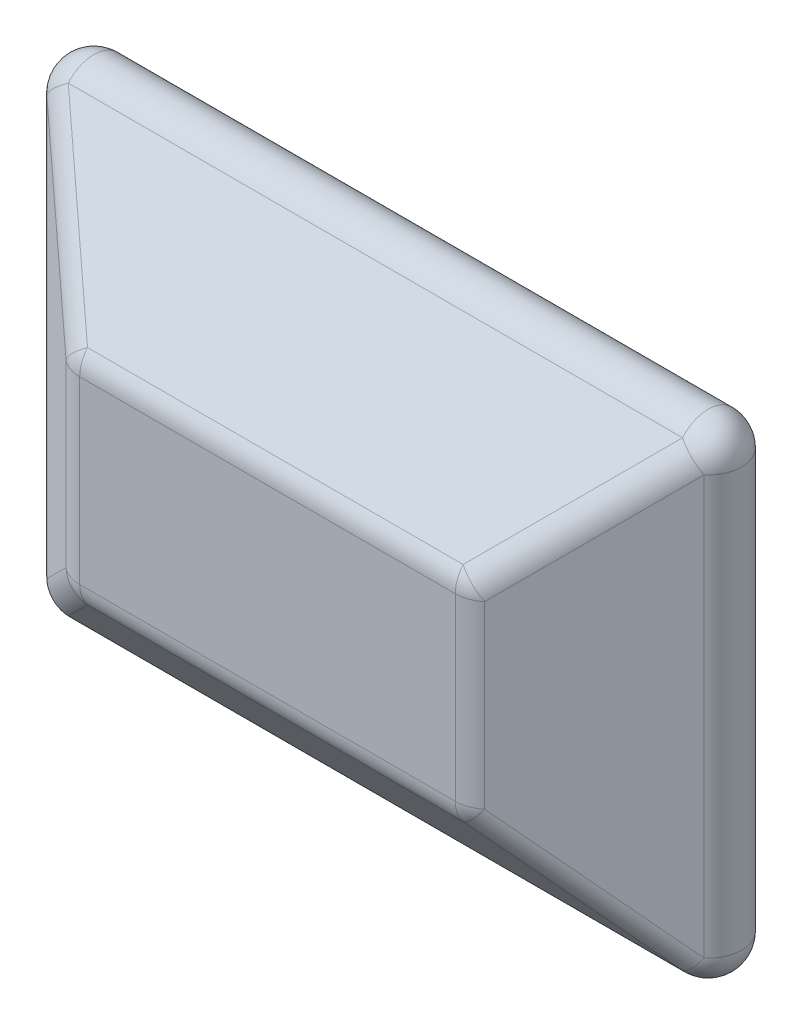
ISO-10303-21;
HEADER;
FILE_DESCRIPTION(('STEP AP214'),'2;1');
FILE_NAME('part.step','',(''),(''),'','','');
FILE_SCHEMA(('AUTOMOTIVE_DESIGN { 1 0 10303 214 1 1 1 1 }'));
ENDSEC;
DATA;
#1=APPLICATION_CONTEXT('core data for automotive mechanical design processes');
#2=APPLICATION_PROTOCOL_DEFINITION('international standard','automotive_design',2000,#1);
#3=PRODUCT_CONTEXT('',#1,'mechanical');
#4=PRODUCT('Part','Part','',(#3));
#5=PRODUCT_RELATED_PRODUCT_CATEGORY('part','',(#4));
#6=PRODUCT_DEFINITION_FORMATION('','',#4);
#7=PRODUCT_DEFINITION_CONTEXT('part definition',#1,'design');
#8=PRODUCT_DEFINITION('design','',#6,#7);
#9=PRODUCT_DEFINITION_SHAPE('','',#8);
#10=(LENGTH_UNIT() NAMED_UNIT(*) SI_UNIT(.MILLI.,.METRE.));
#11=(NAMED_UNIT(*) PLANE_ANGLE_UNIT() SI_UNIT($,.RADIAN.));
#12=(NAMED_UNIT(*) SI_UNIT($,.STERADIAN.) SOLID_ANGLE_UNIT());
#13=UNCERTAINTY_MEASURE_WITH_UNIT(LENGTH_MEASURE(1.E-05),#10,'distance_accuracy_value','');
#14=(GEOMETRIC_REPRESENTATION_CONTEXT(3) GLOBAL_UNCERTAINTY_ASSIGNED_CONTEXT((#13)) GLOBAL_UNIT_ASSIGNED_CONTEXT((#10,
#11,#12)) REPRESENTATION_CONTEXT('',''));
#15=CARTESIAN_POINT('',(0.,0.,0.));
#16=DIRECTION('',(0.,0.,1.));
#17=DIRECTION('',(1.,0.,0.));
#18=AXIS2_PLACEMENT_3D('',#15,#16,#17);
#19=CARTESIAN_POINT('',(-59.9097792499724,-30.5730567785342,50.));
#20=DIRECTION('',(-0.642787609686538,0.,0.766044443118979));
#21=DIRECTION('',(0.766044443118979,0.,0.642787609686538));
#22=AXIS2_PLACEMENT_3D('',#19,#20,#21);
#23=PLANE('',#22);
#24=DIRECTION('',(0.,-1.,0.));
#25=VECTOR('',#24,1.);
#26=CARTESIAN_POINT('',(-62.6979530041757,30.5730567785342,47.6604444311898));
#27=LINE('',#26,#25);
#28=CARTESIAN_POINT('',(-62.6979530041757,-26.9333544358722,47.6604444311898));
#29=VERTEX_POINT('',#28);
#30=CARTESIAN_POINT('',(-62.6979530041757,26.9333544358722,47.6604444311898));
#31=VERTEX_POINT('',#30);
#32=EDGE_CURVE('E217',#29,#31,#27,.F.);
#33=ORIENTED_EDGE('',*,*,#32,.T.);
#34=DIRECTION('',(0.608120402411344,-0.608120402411343,0.510273605374736));
#35=VECTOR('',#34,1.);
#36=CARTESIAN_POINT('',(-39.6744046636424,3.90980609533887,66.9794953521235));
#37=LINE('',#36,#35);
#38=CARTESIAN_POINT('',(-98.4505607820022,62.6859622136986,17.6604444311898));
#39=VERTEX_POINT('',#38);
#40=EDGE_CURVE('E219',#31,#39,#37,.F.);
#41=ORIENTED_EDGE('',*,*,#40,.T.);
#42=DIRECTION('',(0.,-1.,0.));
#43=VECTOR('',#42,1.);
#44=CARTESIAN_POINT('',(-98.4505607820022,-30.5730567785342,17.6604444311898));
#45=LINE('',#44,#43);
#46=CARTESIAN_POINT('',(-98.4505607820022,-62.6859622136986,17.6604444311898));
#47=VERTEX_POINT('',#46);
#48=EDGE_CURVE('E215',#39,#47,#45,.T.);
#49=ORIENTED_EDGE('',*,*,#48,.T.);
#50=DIRECTION('',(0.608120402411344,0.608120402411343,0.510273605374736));
#51=VECTOR('',#50,1.);
#52=CARTESIAN_POINT('',(-62.286874833674,-26.5222762653704,48.0053799724428));
#53=LINE('',#52,#51);
#54=EDGE_CURVE('E213',#47,#29,#53,.T.);
#55=ORIENTED_EDGE('',*,*,#54,.T.);
#56=EDGE_LOOP('',(#33,#41,#49,#55));
#57=FACE_BOUND('',#56,.T.);
#58=ADVANCED_FACE('F33',(#57),#23,.T.);
#59=CARTESIAN_POINT('',(59.9097792499724,-30.5730567785342,50.));
#60=DIRECTION('',(0.,-0.642787609686538,0.766044443118979));
#61=DIRECTION('',(0.,-0.766044443118979,-0.642787609686538));
#62=AXIS2_PLACEMENT_3D('',#59,#60,#61);
#63=PLANE('',#62);
#64=DIRECTION('',(1.,0.,0.));
#65=VECTOR('',#64,1.);
#66=CARTESIAN_POINT('',(-59.9097792499724,-33.3612305327375,47.6604444311898));
#67=LINE('',#66,#65);
#68=CARTESIAN_POINT('',(56.2700769073103,-33.3612305327375,47.6604444311898));
#69=VERTEX_POINT('',#68);
#70=CARTESIAN_POINT('',(-56.2700769073103,-33.3612305327375,47.6604444311898));
#71=VERTEX_POINT('',#70);
#72=EDGE_CURVE('E226',#69,#71,#67,.F.);
#73=ORIENTED_EDGE('',*,*,#72,.T.);
#74=DIRECTION('',(0.608120402411343,0.608120402411344,0.510273605374736));
#75=VECTOR('',#74,1.);
#76=CARTESIAN_POINT('',(-11.5484770249483,11.3603693496245,85.1863223981375));
#77=LINE('',#76,#75);
#78=CARTESIAN_POINT('',(-92.0226846851368,-69.1138383105639,17.6604444311898));
#79=VERTEX_POINT('',#78);
#80=EDGE_CURVE('E228',#71,#79,#77,.F.);
#81=ORIENTED_EDGE('',*,*,#80,.T.);
#82=DIRECTION('',(1.,0.,0.));
#83=VECTOR('',#82,1.);
#84=CARTESIAN_POINT('',(59.9097792499724,-69.1138383105639,17.6604444311898));
#85=LINE('',#84,#83);
#86=CARTESIAN_POINT('',(92.0226846851368,-69.1138383105639,17.6604444311898));
#87=VERTEX_POINT('',#86);
#88=EDGE_CURVE('E224',#79,#87,#85,.T.);
#89=ORIENTED_EDGE('',*,*,#88,.T.);
#90=DIRECTION('',(-0.608120402411343,0.608120402411344,0.510273605374736));
#91=VECTOR('',#90,1.);
#92=CARTESIAN_POINT('',(55.8589987368086,-32.9501523622358,48.0053799724428));
#93=LINE('',#92,#91);
#94=EDGE_CURVE('E222',#87,#69,#93,.T.);
#95=ORIENTED_EDGE('',*,*,#94,.T.);
#96=EDGE_LOOP('',(#73,#81,#89,#95));
#97=FACE_BOUND('',#96,.T.);
#98=ADVANCED_FACE('F342',(#97),#63,.T.);
#99=CARTESIAN_POINT('',(59.9097792499724,-30.5730567785342,50.));
#100=DIRECTION('',(0.642787609686538,0.,0.766044443118979));
#101=DIRECTION('',(0.766044443118979,0.,-0.642787609686538));
#102=AXIS2_PLACEMENT_3D('',#99,#100,#101);
#103=PLANE('',#102);
#104=DIRECTION('',(0.,1.,0.));
#105=VECTOR('',#104,1.);
#106=CARTESIAN_POINT('',(62.6979530041757,-30.5730567785342,47.6604444311898));
#107=LINE('',#106,#105);
#108=CARTESIAN_POINT('',(62.6979530041757,26.9333544358721,47.6604444311898));
#109=VERTEX_POINT('',#108);
#110=CARTESIAN_POINT('',(62.6979530041757,-26.9333544358722,47.6604444311898));
#111=VERTEX_POINT('',#110);
#112=EDGE_CURVE('E42',#109,#111,#107,.F.);
#113=ORIENTED_EDGE('',*,*,#112,.T.);
#114=DIRECTION('',(-0.608120402411344,0.608120402411343,0.510273605374736));
#115=VECTOR('',#114,1.);
#116=CARTESIAN_POINT('',(62.286874833674,-26.5222762653704,48.0053799724428));
#117=LINE('',#116,#115);
#118=CARTESIAN_POINT('',(98.4505607820022,-62.6859622136986,17.6604444311898));
#119=VERTEX_POINT('',#118);
#120=EDGE_CURVE('E11',#111,#119,#117,.F.);
#121=ORIENTED_EDGE('',*,*,#120,.T.);
#122=DIRECTION('',(0.,1.,0.));
#123=VECTOR('',#122,1.);
#124=CARTESIAN_POINT('',(98.4505607820022,-30.5730567785342,17.6604444311898));
#125=LINE('',#124,#123);
#126=CARTESIAN_POINT('',(98.4505607820022,62.6859622136986,17.6604444311898));
#127=VERTEX_POINT('',#126);
#128=EDGE_CURVE('E231',#119,#127,#125,.T.);
#129=ORIENTED_EDGE('',*,*,#128,.T.);
#130=DIRECTION('',(-0.608120402411344,-0.608120402411343,0.510273605374736));
#131=VECTOR('',#130,1.);
#132=CARTESIAN_POINT('',(39.6744046636424,3.90980609533886,66.9794953521235));
#133=LINE('',#132,#131);
#134=EDGE_CURVE('E233',#127,#109,#133,.T.);
#135=ORIENTED_EDGE('',*,*,#134,.T.);
#136=EDGE_LOOP('',(#113,#121,#129,#135));
#137=FACE_BOUND('',#136,.T.);
#138=ADVANCED_FACE('F316',(#137),#103,.T.);
#139=CARTESIAN_POINT('',(59.9097792499724,30.5730567785342,50.));
#140=DIRECTION('',(0.,0.642787609686538,0.766044443118979));
#141=DIRECTION('',(0.,-0.766044443118979,0.642787609686538));
#142=AXIS2_PLACEMENT_3D('',#139,#140,#141);
#143=PLANE('',#142);
#144=DIRECTION('',(-1.,0.,0.));
#145=VECTOR('',#144,1.);
#146=CARTESIAN_POINT('',(59.9097792499724,69.1138383105639,17.6604444311898));
#147=LINE('',#146,#145);
#148=CARTESIAN_POINT('',(92.0226846851368,69.1138383105639,17.6604444311898));
#149=VERTEX_POINT('',#148);
#150=CARTESIAN_POINT('',(-92.0226846851368,69.1138383105639,17.6604444311898));
#151=VERTEX_POINT('',#150);
#152=EDGE_CURVE('E197',#149,#151,#147,.T.);
#153=ORIENTED_EDGE('',*,*,#152,.T.);
#154=DIRECTION('',(0.608120402411343,-0.608120402411344,0.510273605374736));
#155=VECTOR('',#154,1.);
#156=CARTESIAN_POINT('',(-11.5484770249483,-11.3603693496245,85.1863223981375));
#157=LINE('',#156,#155);
#158=CARTESIAN_POINT('',(-56.2700769073103,33.3612305327375,47.6604444311898));
#159=VERTEX_POINT('',#158);
#160=EDGE_CURVE('E202',#151,#159,#157,.T.);
#161=ORIENTED_EDGE('',*,*,#160,.T.);
#162=DIRECTION('',(-1.,0.,0.));
#163=VECTOR('',#162,1.);
#164=CARTESIAN_POINT('',(59.9097792499724,33.3612305327375,47.6604444311898));
#165=LINE('',#164,#163);
#166=CARTESIAN_POINT('',(56.2700769073104,33.3612305327375,47.6604444311898));
#167=VERTEX_POINT('',#166);
#168=EDGE_CURVE('E199',#159,#167,#165,.F.);
#169=ORIENTED_EDGE('',*,*,#168,.T.);
#170=DIRECTION('',(-0.608120402411343,-0.608120402411344,0.510273605374736));
#171=VECTOR('',#170,1.);
#172=CARTESIAN_POINT('',(55.8589987368087,32.9501523622358,48.0053799724428));
#173=LINE('',#172,#171);
#174=EDGE_CURVE('E195',#167,#149,#173,.F.);
#175=ORIENTED_EDGE('',*,*,#174,.T.);
#176=EDGE_LOOP('',(#153,#161,#169,#175));
#177=FACE_BOUND('',#176,.T.);
#178=ADVANCED_FACE('F405',(#177),#143,.T.);
#179=CARTESIAN_POINT('',(0.,0.,50.));
#180=DIRECTION('',(0.,0.,1.));
#181=DIRECTION('',(1.,0.,0.));
#182=AXIS2_PLACEMENT_3D('',#179,#180,#181);
#183=PLANE('',#182);
#184=DIRECTION('',(0.,-1.,0.));
#185=VECTOR('',#184,1.);
#186=CARTESIAN_POINT('',(56.2700769073103,30.5730567785342,50.));
#187=LINE('',#186,#185);
#188=CARTESIAN_POINT('',(56.2700769073103,-26.9333544358721,50.));
#189=VERTEX_POINT('',#188);
#190=CARTESIAN_POINT('',(56.2700769073103,26.9333544358721,50.));
#191=VERTEX_POINT('',#190);
#192=EDGE_CURVE('E186',#189,#191,#187,.F.);
#193=ORIENTED_EDGE('',*,*,#192,.T.);
#194=DIRECTION('',(1.,0.,0.));
#195=VECTOR('',#194,1.);
#196=CARTESIAN_POINT('',(-59.9097792499724,26.9333544358721,50.));
#197=LINE('',#196,#195);
#198=CARTESIAN_POINT('',(-56.2700769073103,26.9333544358721,50.));
#199=VERTEX_POINT('',#198);
#200=EDGE_CURVE('E192',#191,#199,#197,.F.);
#201=ORIENTED_EDGE('',*,*,#200,.T.);
#202=DIRECTION('',(0.,1.,0.));
#203=VECTOR('',#202,1.);
#204=CARTESIAN_POINT('',(-56.2700769073103,-30.5730567785342,50.));
#205=LINE('',#204,#203);
#206=CARTESIAN_POINT('',(-56.2700769073103,-26.9333544358721,50.));
#207=VERTEX_POINT('',#206);
#208=EDGE_CURVE('E190',#199,#207,#205,.F.);
#209=ORIENTED_EDGE('',*,*,#208,.T.);
#210=DIRECTION('',(-1.,0.,0.));
#211=VECTOR('',#210,1.);
#212=CARTESIAN_POINT('',(59.9097792499724,-26.9333544358721,50.));
#213=LINE('',#212,#211);
#214=EDGE_CURVE('E188',#207,#189,#213,.F.);
#215=ORIENTED_EDGE('',*,*,#214,.T.);
#216=EDGE_LOOP('',(#193,#201,#209,#215));
#217=FACE_BOUND('',#216,.T.);
#218=ADVANCED_FACE('F332',(#217),#183,.T.);
#219=CARTESIAN_POINT('',(0.,0.,0.));
#220=DIRECTION('',(0.,0.,1.));
#221=DIRECTION('',(1.,0.,0.));
#222=AXIS2_PLACEMENT_3D('',#219,#220,#221);
#223=PLANE('',#222);
#224=DIRECTION('',(-1.,0.,0.));
#225=VECTOR('',#224,1.);
#226=CARTESIAN_POINT('',(-57.4134249538716,-31.7213359965365,0.));
#227=LINE('',#226,#225);
#228=CARTESIAN_POINT('',(57.4134249538716,-31.7213359965365,0.));
#229=VERTEX_POINT('',#228);
#230=CARTESIAN_POINT('',(-57.4134249538716,-31.7213359965365,0.));
#231=VERTEX_POINT('',#230);
#232=EDGE_CURVE('E176',#229,#231,#227,.T.);
#233=ORIENTED_EDGE('',*,*,#232,.F.);
#234=DIRECTION('',(0.,-1.,0.));
#235=VECTOR('',#234,1.);
#236=CARTESIAN_POINT('',(57.4134249538716,31.7213359965365,0.));
#237=LINE('',#236,#235);
#238=CARTESIAN_POINT('',(57.4134249538716,31.7213359965365,0.));
#239=VERTEX_POINT('',#238);
#240=EDGE_CURVE('E50',#239,#229,#237,.T.);
#241=ORIENTED_EDGE('',*,*,#240,.F.);
#242=DIRECTION('',(1.,0.,0.));
#243=VECTOR('',#242,1.);
#244=CARTESIAN_POINT('',(-57.4134249538716,31.7213359965365,0.));
#245=LINE('',#244,#243);
#246=CARTESIAN_POINT('',(-57.4134249538716,31.7213359965365,0.));
#247=VERTEX_POINT('',#246);
#248=EDGE_CURVE('E167',#247,#239,#245,.T.);
#249=ORIENTED_EDGE('',*,*,#248,.F.);
#250=DIRECTION('',(0.,1.,0.));
#251=VECTOR('',#250,1.);
#252=CARTESIAN_POINT('',(-57.4134249538716,31.7213359965365,0.));
#253=LINE('',#252,#251);
#254=EDGE_CURVE('E170',#231,#247,#253,.T.);
#255=ORIENTED_EDGE('',*,*,#254,.F.);
#256=EDGE_LOOP('',(#233,#241,#249,#255));
#257=FACE_BOUND('',#256,.T.);
#258=DIRECTION('',(0.,1.,0.));
#259=VECTOR('',#258,1.);
#260=CARTESIAN_POINT('',(-92.0226846851368,0.,0.));
#261=LINE('',#260,#259);
#262=CARTESIAN_POINT('',(-92.0226846851368,-62.6859622136986,0.));
#263=VERTEX_POINT('',#262);
#264=CARTESIAN_POINT('',(-92.0226846851368,62.6859622136986,0.));
#265=VERTEX_POINT('',#264);
#266=EDGE_CURVE('E208',#263,#265,#261,.T.);
#267=ORIENTED_EDGE('',*,*,#266,.T.);
#268=DIRECTION('',(1.,0.,0.));
#269=VECTOR('',#268,1.);
#270=CARTESIAN_POINT('',(0.,62.6859622136986,0.));
#271=LINE('',#270,#269);
#272=CARTESIAN_POINT('',(92.0226846851368,62.6859622136986,0.));
#273=VERTEX_POINT('',#272);
#274=EDGE_CURVE('E210',#265,#273,#271,.T.);
#275=ORIENTED_EDGE('',*,*,#274,.T.);
#276=DIRECTION('',(0.,-1.,0.));
#277=VECTOR('',#276,1.);
#278=CARTESIAN_POINT('',(92.0226846851368,0.,0.));
#279=LINE('',#278,#277);
#280=CARTESIAN_POINT('',(92.0226846851368,-62.6859622136986,0.));
#281=VERTEX_POINT('',#280);
#282=EDGE_CURVE('E204',#273,#281,#279,.T.);
#283=ORIENTED_EDGE('',*,*,#282,.T.);
#284=DIRECTION('',(-1.,0.,0.));
#285=VECTOR('',#284,1.);
#286=CARTESIAN_POINT('',(0.,-62.6859622136986,0.));
#287=LINE('',#286,#285);
#288=EDGE_CURVE('E206',#281,#263,#287,.T.);
#289=ORIENTED_EDGE('',*,*,#288,.T.);
#290=EDGE_LOOP('',(#267,#275,#283,#289));
#291=FACE_BOUND('',#290,.T.);
#292=ADVANCED_FACE('F356',(#257,#291),#223,.F.);
#293=CARTESIAN_POINT('',(59.9097792499724,-62.6859622136986,10.));
#294=DIRECTION('',(-1.,0.,0.));
#295=DIRECTION('',(0.,0.,1.));
#296=AXIS2_PLACEMENT_3D('',#293,#294,#295);
#297=CYLINDRICAL_SURFACE('',#296,10.);
#298=CARTESIAN_POINT('',(92.0226846851368,-62.6859622136986,10.));
#299=DIRECTION('',(1.,0.,0.));
#300=DIRECTION('',(0.,1.,0.));
#301=AXIS2_PLACEMENT_3D('',#298,#299,#300);
#302=CIRCLE('',#301,10.);
#303=EDGE_CURVE('E37',#87,#281,#302,.T.);
#304=ORIENTED_EDGE('',*,*,#303,.F.);
#305=ORIENTED_EDGE('',*,*,#88,.F.);
#306=CARTESIAN_POINT('',(-92.0226846851368,-62.6859622136986,10.));
#307=DIRECTION('',(-1.,0.,0.));
#308=DIRECTION('',(0.,-1.,0.));
#309=AXIS2_PLACEMENT_3D('',#306,#307,#308);
#310=CIRCLE('',#309,10.);
#311=EDGE_CURVE('E295',#263,#79,#310,.T.);
#312=ORIENTED_EDGE('',*,*,#311,.F.);
#313=ORIENTED_EDGE('',*,*,#288,.F.);
#314=EDGE_LOOP('',(#304,#305,#312,#313));
#315=FACE_BOUND('',#314,.T.);
#316=ADVANCED_FACE('F35',(#315),#297,.T.);
#317=CARTESIAN_POINT('',(92.0226846851368,-62.6859622136986,10.));
#318=DIRECTION('',(0.,0.,1.));
#319=DIRECTION('',(1.,0.,0.));
#320=AXIS2_PLACEMENT_3D('',#317,#318,#319);
#321=SPHERICAL_SURFACE('',#320,10.);
#322=CARTESIAN_POINT('',(92.0226846851368,-62.6859622136986,10.));
#323=DIRECTION('',(0.608120402411344,-0.608120402411343,-0.510273605374735));
#324=DIRECTION('',(0.707106781186547,0.707106781186548,0.));
#325=AXIS2_PLACEMENT_3D('',#322,#323,#324);
#326=CIRCLE('',#325,10.);
#327=EDGE_CURVE('E290',#87,#119,#326,.F.);
#328=ORIENTED_EDGE('',*,*,#327,.F.);
#329=ORIENTED_EDGE('',*,*,#303,.T.);
#330=CARTESIAN_POINT('',(92.0226846851368,-62.6859622136986,10.));
#331=DIRECTION('',(0.,-1.,0.));
#332=DIRECTION('',(1.,0.,0.));
#333=AXIS2_PLACEMENT_3D('',#330,#331,#332);
#334=CIRCLE('',#333,10.);
#335=EDGE_CURVE('E293',#119,#281,#334,.F.);
#336=ORIENTED_EDGE('',*,*,#335,.F.);
#337=EDGE_LOOP('',(#328,#329,#336));
#338=FACE_BOUND('',#337,.T.);
#339=ADVANCED_FACE('F307',(#338),#321,.T.);
#340=CARTESIAN_POINT('',(-92.0226846851368,-62.6859622136986,10.));
#341=DIRECTION('',(0.,0.,1.));
#342=DIRECTION('',(1.,0.,0.));
#343=AXIS2_PLACEMENT_3D('',#340,#341,#342);
#344=SPHERICAL_SURFACE('',#343,10.);
#345=CARTESIAN_POINT('',(-92.0226846851368,-62.6859622136986,10.));
#346=DIRECTION('',(0.,-1.,0.));
#347=DIRECTION('',(0.,0.,-1.));
#348=AXIS2_PLACEMENT_3D('',#345,#346,#347);
#349=CIRCLE('',#348,10.);
#350=EDGE_CURVE('E285',#263,#47,#349,.F.);
#351=ORIENTED_EDGE('',*,*,#350,.F.);
#352=ORIENTED_EDGE('',*,*,#311,.T.);
#353=CARTESIAN_POINT('',(-92.0226846851368,-62.6859622136986,10.));
#354=DIRECTION('',(-0.608120402411343,-0.608120402411344,-0.510273605374736));
#355=DIRECTION('',(0.707106781186548,-0.707106781186547,0.));
#356=AXIS2_PLACEMENT_3D('',#353,#354,#355);
#357=CIRCLE('',#356,10.);
#358=EDGE_CURVE('E288',#47,#79,#357,.F.);
#359=ORIENTED_EDGE('',*,*,#358,.F.);
#360=EDGE_LOOP('',(#351,#352,#359));
#361=FACE_BOUND('',#360,.T.);
#362=ADVANCED_FACE('F348',(#361),#344,.T.);
#363=CARTESIAN_POINT('',(92.0226846851368,-30.5730567785342,10.));
#364=DIRECTION('',(0.,-1.,0.));
#365=DIRECTION('',(0.,0.,-1.));
#366=AXIS2_PLACEMENT_3D('',#363,#364,#365);
#367=CYLINDRICAL_SURFACE('',#366,10.);
#368=ORIENTED_EDGE('',*,*,#335,.T.);
#369=ORIENTED_EDGE('',*,*,#282,.F.);
#370=CARTESIAN_POINT('',(92.0226846851368,62.6859622136986,10.));
#371=DIRECTION('',(0.,1.,0.));
#372=DIRECTION('',(-1.,0.,0.));
#373=AXIS2_PLACEMENT_3D('',#370,#371,#372);
#374=CIRCLE('',#373,10.);
#375=EDGE_CURVE('E280',#127,#273,#374,.T.);
#376=ORIENTED_EDGE('',*,*,#375,.F.);
#377=ORIENTED_EDGE('',*,*,#128,.F.);
#378=EDGE_LOOP('',(#368,#369,#376,#377));
#379=FACE_BOUND('',#378,.T.);
#380=ADVANCED_FACE('F313',(#379),#367,.T.);
#381=CARTESIAN_POINT('',(55.8589987368086,-26.5222762653704,40.344935541253));
#382=DIRECTION('',(0.608120402411343,-0.608120402411343,-0.510273605374736));
#383=DIRECTION('',(0.707106781186548,0.707106781186548,0.));
#384=AXIS2_PLACEMENT_3D('',#381,#382,#383);
#385=CYLINDRICAL_SURFACE('',#384,10.);
#386=ORIENTED_EDGE('',*,*,#327,.T.);
#387=ORIENTED_EDGE('',*,*,#120,.F.);
#388=CARTESIAN_POINT('',(56.2700769073103,-26.9333544358721,40.));
#389=DIRECTION('',(-0.608120402411343,0.608120402411344,0.510273605374736));
#390=DIRECTION('',(-0.707106781186548,-0.707106781186547,0.));
#391=AXIS2_PLACEMENT_3D('',#388,#389,#390);
#392=CIRCLE('',#391,10.);
#393=EDGE_CURVE('E277',#69,#111,#392,.T.);
#394=ORIENTED_EDGE('',*,*,#393,.F.);
#395=ORIENTED_EDGE('',*,*,#94,.F.);
#396=EDGE_LOOP('',(#386,#387,#394,#395));
#397=FACE_BOUND('',#396,.T.);
#398=ADVANCED_FACE('F320',(#397),#385,.T.);
#399=CARTESIAN_POINT('',(0.,-26.9333544358721,40.));
#400=DIRECTION('',(1.,0.,0.));
#401=DIRECTION('',(0.,0.,-1.));
#402=AXIS2_PLACEMENT_3D('',#399,#400,#401);
#403=CYLINDRICAL_SURFACE('',#402,10.);
#404=CARTESIAN_POINT('',(-56.2700769073103,-26.9333544358721,40.));
#405=DIRECTION('',(-1.,0.,0.));
#406=DIRECTION('',(0.,-1.,0.));
#407=AXIS2_PLACEMENT_3D('',#404,#405,#406);
#408=CIRCLE('',#407,10.);
#409=EDGE_CURVE('E271',#71,#207,#408,.T.);
#410=ORIENTED_EDGE('',*,*,#409,.F.);
#411=ORIENTED_EDGE('',*,*,#72,.F.);
#412=CARTESIAN_POINT('',(56.2700769073103,-26.9333544358721,40.));
#413=DIRECTION('',(1.,0.,0.));
#414=DIRECTION('',(0.,1.,0.));
#415=AXIS2_PLACEMENT_3D('',#412,#413,#414);
#416=CIRCLE('',#415,10.);
#417=EDGE_CURVE('E274',#189,#69,#416,.T.);
#418=ORIENTED_EDGE('',*,*,#417,.F.);
#419=ORIENTED_EDGE('',*,*,#214,.F.);
#420=EDGE_LOOP('',(#410,#411,#418,#419));
#421=FACE_BOUND('',#420,.T.);
#422=ADVANCED_FACE('F339',(#421),#403,.T.);
#423=CARTESIAN_POINT('',(-11.5484770249483,17.7882454464899,77.5258779669477));
#424=DIRECTION('',(-0.608120402411343,-0.608120402411343,-0.510273605374736));
#425=DIRECTION('',(0.707106781186548,-0.707106781186548,0.));
#426=AXIS2_PLACEMENT_3D('',#423,#424,#425);
#427=CYLINDRICAL_SURFACE('',#426,10.);
#428=ORIENTED_EDGE('',*,*,#358,.T.);
#429=ORIENTED_EDGE('',*,*,#80,.F.);
#430=CARTESIAN_POINT('',(-56.2700769073104,-26.9333544358722,40.));
#431=DIRECTION('',(0.608120402411343,0.608120402411345,0.510273605374734));
#432=DIRECTION('',(-0.707106781186549,0.707106781186546,0.));
#433=AXIS2_PLACEMENT_3D('',#430,#431,#432);
#434=CIRCLE('',#433,10.);
#435=EDGE_CURVE('E268',#29,#71,#434,.T.);
#436=ORIENTED_EDGE('',*,*,#435,.F.);
#437=ORIENTED_EDGE('',*,*,#54,.F.);
#438=EDGE_LOOP('',(#428,#429,#436,#437));
#439=FACE_BOUND('',#438,.T.);
#440=ADVANCED_FACE('F345',(#439),#427,.T.);
#441=CARTESIAN_POINT('',(-92.0226846851368,-30.5730567785342,10.));
#442=DIRECTION('',(0.,1.,0.));
#443=DIRECTION('',(0.,0.,1.));
#444=AXIS2_PLACEMENT_3D('',#441,#442,#443);
#445=CYLINDRICAL_SURFACE('',#444,10.);
#446=ORIENTED_EDGE('',*,*,#350,.T.);
#447=ORIENTED_EDGE('',*,*,#48,.F.);
#448=CARTESIAN_POINT('',(-92.0226846851368,62.6859622136986,10.));
#449=DIRECTION('',(0.,1.,0.));
#450=DIRECTION('',(0.,0.,1.));
#451=AXIS2_PLACEMENT_3D('',#448,#449,#450);
#452=CIRCLE('',#451,10.);
#453=EDGE_CURVE('E265',#265,#39,#452,.T.);
#454=ORIENTED_EDGE('',*,*,#453,.F.);
#455=ORIENTED_EDGE('',*,*,#266,.F.);
#456=EDGE_LOOP('',(#446,#447,#454,#455));
#457=FACE_BOUND('',#456,.T.);
#458=ADVANCED_FACE('F353',(#457),#445,.T.);
#459=CARTESIAN_POINT('',(59.9097792499724,62.6859622136986,10.));
#460=DIRECTION('',(1.,0.,0.));
#461=DIRECTION('',(0.,0.,-1.));
#462=AXIS2_PLACEMENT_3D('',#459,#460,#461);
#463=CYLINDRICAL_SURFACE('',#462,10.);
#464=CARTESIAN_POINT('',(92.0226846851368,62.6859622136986,10.));
#465=DIRECTION('',(1.,0.,0.));
#466=DIRECTION('',(0.,0.,-1.));
#467=AXIS2_PLACEMENT_3D('',#464,#465,#466);
#468=CIRCLE('',#467,10.);
#469=EDGE_CURVE('E282',#273,#149,#468,.T.);
#470=ORIENTED_EDGE('',*,*,#469,.F.);
#471=ORIENTED_EDGE('',*,*,#274,.F.);
#472=CARTESIAN_POINT('',(-92.0226846851368,62.6859622136986,10.));
#473=DIRECTION('',(-1.,0.,0.));
#474=DIRECTION('',(0.,-1.,0.));
#475=AXIS2_PLACEMENT_3D('',#472,#473,#474);
#476=CIRCLE('',#475,10.);
#477=EDGE_CURVE('E262',#151,#265,#476,.T.);
#478=ORIENTED_EDGE('',*,*,#477,.F.);
#479=ORIENTED_EDGE('',*,*,#152,.F.);
#480=EDGE_LOOP('',(#470,#471,#478,#479));
#481=FACE_BOUND('',#480,.T.);
#482=ADVANCED_FACE('F360',(#481),#463,.T.);
#483=CARTESIAN_POINT('',(92.0226846851368,62.6859622136986,10.));
#484=DIRECTION('',(0.,0.,1.));
#485=DIRECTION('',(1.,0.,0.));
#486=AXIS2_PLACEMENT_3D('',#483,#484,#485);
#487=SPHERICAL_SURFACE('',#486,10.);
#488=ORIENTED_EDGE('',*,*,#375,.T.);
#489=ORIENTED_EDGE('',*,*,#469,.T.);
#490=CARTESIAN_POINT('',(92.0226846851368,62.6859622136986,10.));
#491=DIRECTION('',(0.608120402411344,0.608120402411343,-0.510273605374735));
#492=DIRECTION('',(-0.707106781186547,0.707106781186548,0.));
#493=AXIS2_PLACEMENT_3D('',#490,#491,#492);
#494=CIRCLE('',#493,10.);
#495=EDGE_CURVE('E259',#127,#149,#494,.F.);
#496=ORIENTED_EDGE('',*,*,#495,.F.);
#497=EDGE_LOOP('',(#488,#489,#496));
#498=FACE_BOUND('',#497,.T.);
#499=ADVANCED_FACE('F364',(#498),#487,.T.);
#500=CARTESIAN_POINT('',(56.2700769073103,-26.9333544358721,40.));
#501=DIRECTION('',(0.,0.,1.));
#502=DIRECTION('',(1.,0.,0.));
#503=AXIS2_PLACEMENT_3D('',#500,#501,#502);
#504=SPHERICAL_SURFACE('',#503,10.);
#505=ORIENTED_EDGE('',*,*,#417,.T.);
#506=ORIENTED_EDGE('',*,*,#393,.T.);
#507=CARTESIAN_POINT('',(56.2700769073104,-26.9333544358722,40.));
#508=DIRECTION('',(0.,-1.,0.));
#509=DIRECTION('',(1.,0.,0.));
#510=AXIS2_PLACEMENT_3D('',#507,#508,#509);
#511=CIRCLE('',#510,10.);
#512=EDGE_CURVE('E256',#189,#111,#511,.F.);
#513=ORIENTED_EDGE('',*,*,#512,.F.);
#514=EDGE_LOOP('',(#505,#506,#513));
#515=FACE_BOUND('',#514,.T.);
#516=ADVANCED_FACE('F323',(#515),#504,.T.);
#517=CARTESIAN_POINT('',(-56.2700769073103,-26.9333544358721,40.));
#518=DIRECTION('',(0.,0.,1.));
#519=DIRECTION('',(1.,0.,0.));
#520=AXIS2_PLACEMENT_3D('',#517,#518,#519);
#521=SPHERICAL_SURFACE('',#520,10.);
#522=ORIENTED_EDGE('',*,*,#435,.T.);
#523=ORIENTED_EDGE('',*,*,#409,.T.);
#524=CARTESIAN_POINT('',(-56.2700769073103,-26.9333544358721,40.));
#525=DIRECTION('',(0.,-1.,0.));
#526=DIRECTION('',(1.,0.,0.));
#527=AXIS2_PLACEMENT_3D('',#524,#525,#526);
#528=CIRCLE('',#527,10.);
#529=EDGE_CURVE('E253',#29,#207,#528,.F.);
#530=ORIENTED_EDGE('',*,*,#529,.F.);
#531=EDGE_LOOP('',(#522,#523,#530));
#532=FACE_BOUND('',#531,.T.);
#533=ADVANCED_FACE('F382',(#532),#521,.T.);
#534=CARTESIAN_POINT('',(-92.0226846851368,62.6859622136986,10.));
#535=DIRECTION('',(0.,0.,1.));
#536=DIRECTION('',(1.,0.,0.));
#537=AXIS2_PLACEMENT_3D('',#534,#535,#536);
#538=SPHERICAL_SURFACE('',#537,10.);
#539=ORIENTED_EDGE('',*,*,#477,.T.);
#540=ORIENTED_EDGE('',*,*,#453,.T.);
#541=CARTESIAN_POINT('',(-92.0226846851368,62.6859622136986,10.));
#542=DIRECTION('',(-0.608120402411343,0.608120402411344,-0.510273605374735));
#543=DIRECTION('',(-0.707106781186548,-0.707106781186547,0.));
#544=AXIS2_PLACEMENT_3D('',#541,#542,#543);
#545=CIRCLE('',#544,10.);
#546=EDGE_CURVE('E251',#151,#39,#545,.F.);
#547=ORIENTED_EDGE('',*,*,#546,.F.);
#548=EDGE_LOOP('',(#539,#540,#547));
#549=FACE_BOUND('',#548,.T.);
#550=ADVANCED_FACE('F384',(#549),#538,.T.);
#551=CARTESIAN_POINT('',(55.8589987368087,26.5222762653704,40.344935541253));
#552=DIRECTION('',(0.608120402411343,0.608120402411343,-0.510273605374736));
#553=DIRECTION('',(-0.707106781186548,0.707106781186548,0.));
#554=AXIS2_PLACEMENT_3D('',#551,#552,#553);
#555=CYLINDRICAL_SURFACE('',#554,10.);
#556=ORIENTED_EDGE('',*,*,#495,.T.);
#557=ORIENTED_EDGE('',*,*,#174,.F.);
#558=CARTESIAN_POINT('',(56.2700769073104,26.9333544358721,40.));
#559=DIRECTION('',(-0.608120402411344,-0.608120402411343,0.510273605374735));
#560=DIRECTION('',(0.707106781186547,-0.707106781186548,0.));
#561=AXIS2_PLACEMENT_3D('',#558,#559,#560);
#562=CIRCLE('',#561,10.);
#563=EDGE_CURVE('E248',#109,#167,#562,.T.);
#564=ORIENTED_EDGE('',*,*,#563,.F.);
#565=ORIENTED_EDGE('',*,*,#134,.F.);
#566=EDGE_LOOP('',(#556,#557,#564,#565));
#567=FACE_BOUND('',#566,.T.);
#568=ADVANCED_FACE('F367',(#567),#555,.T.);
#569=CARTESIAN_POINT('',(56.2700769073103,0.,40.));
#570=DIRECTION('',(0.,1.,0.));
#571=DIRECTION('',(0.,0.,1.));
#572=AXIS2_PLACEMENT_3D('',#569,#570,#571);
#573=CYLINDRICAL_SURFACE('',#572,10.);
#574=ORIENTED_EDGE('',*,*,#512,.T.);
#575=ORIENTED_EDGE('',*,*,#112,.F.);
#576=CARTESIAN_POINT('',(56.2700769073103,26.9333544358721,40.));
#577=DIRECTION('',(0.,1.,0.));
#578=DIRECTION('',(-1.,0.,0.));
#579=AXIS2_PLACEMENT_3D('',#576,#577,#578);
#580=CIRCLE('',#579,10.);
#581=EDGE_CURVE('E245',#191,#109,#580,.T.);
#582=ORIENTED_EDGE('',*,*,#581,.F.);
#583=ORIENTED_EDGE('',*,*,#192,.F.);
#584=EDGE_LOOP('',(#574,#575,#582,#583));
#585=FACE_BOUND('',#584,.T.);
#586=ADVANCED_FACE('F327',(#585),#573,.T.);
#587=CARTESIAN_POINT('',(-56.2700769073103,0.,40.));
#588=DIRECTION('',(0.,-1.,0.));
#589=DIRECTION('',(0.,0.,-1.));
#590=AXIS2_PLACEMENT_3D('',#587,#588,#589);
#591=CYLINDRICAL_SURFACE('',#590,10.);
#592=ORIENTED_EDGE('',*,*,#529,.T.);
#593=ORIENTED_EDGE('',*,*,#208,.F.);
#594=CARTESIAN_POINT('',(-56.2700769073104,26.9333544358722,40.));
#595=DIRECTION('',(0.,1.,0.));
#596=DIRECTION('',(-1.,0.,0.));
#597=AXIS2_PLACEMENT_3D('',#594,#595,#596);
#598=CIRCLE('',#597,10.);
#599=EDGE_CURVE('E242',#31,#199,#598,.T.);
#600=ORIENTED_EDGE('',*,*,#599,.F.);
#601=ORIENTED_EDGE('',*,*,#32,.F.);
#602=EDGE_LOOP('',(#592,#593,#600,#601));
#603=FACE_BOUND('',#602,.T.);
#604=ADVANCED_FACE('F380',(#603),#591,.T.);
#605=CARTESIAN_POINT('',(-33.2465285667771,3.90980609533886,59.3190509209337));
#606=DIRECTION('',(-0.608120402411343,0.608120402411343,-0.510273605374736));
#607=DIRECTION('',(-0.707106781186548,-0.707106781186548,0.));
#608=AXIS2_PLACEMENT_3D('',#605,#606,#607);
#609=CYLINDRICAL_SURFACE('',#608,10.);
#610=ORIENTED_EDGE('',*,*,#546,.T.);
#611=ORIENTED_EDGE('',*,*,#40,.F.);
#612=CARTESIAN_POINT('',(-56.2700769073103,26.9333544358721,40.));
#613=DIRECTION('',(0.608120402411342,-0.608120402411344,0.510273605374736));
#614=DIRECTION('',(0.707106781186548,0.707106781186546,0.));
#615=AXIS2_PLACEMENT_3D('',#612,#613,#614);
#616=CIRCLE('',#615,10.);
#617=EDGE_CURVE('E239',#159,#31,#616,.T.);
#618=ORIENTED_EDGE('',*,*,#617,.F.);
#619=ORIENTED_EDGE('',*,*,#160,.F.);
#620=EDGE_LOOP('',(#610,#611,#618,#619));
#621=FACE_BOUND('',#620,.T.);
#622=ADVANCED_FACE('F415',(#621),#609,.T.);
#623=CARTESIAN_POINT('',(56.2700769073103,26.9333544358721,40.));
#624=DIRECTION('',(0.,0.,1.));
#625=DIRECTION('',(1.,0.,0.));
#626=AXIS2_PLACEMENT_3D('',#623,#624,#625);
#627=SPHERICAL_SURFACE('',#626,10.);
#628=ORIENTED_EDGE('',*,*,#581,.T.);
#629=ORIENTED_EDGE('',*,*,#563,.T.);
#630=CARTESIAN_POINT('',(56.2700769073104,26.9333544358721,40.));
#631=DIRECTION('',(1.,0.,0.));
#632=DIRECTION('',(0.,1.,0.));
#633=AXIS2_PLACEMENT_3D('',#630,#631,#632);
#634=CIRCLE('',#633,10.);
#635=EDGE_CURVE('E237',#191,#167,#634,.F.);
#636=ORIENTED_EDGE('',*,*,#635,.F.);
#637=EDGE_LOOP('',(#628,#629,#636));
#638=FACE_BOUND('',#637,.T.);
#639=ADVANCED_FACE('F369',(#638),#627,.T.);
#640=CARTESIAN_POINT('',(-56.2700769073103,26.9333544358721,40.));
#641=DIRECTION('',(0.,0.,1.));
#642=DIRECTION('',(1.,0.,0.));
#643=AXIS2_PLACEMENT_3D('',#640,#641,#642);
#644=SPHERICAL_SURFACE('',#643,10.);
#645=ORIENTED_EDGE('',*,*,#617,.T.);
#646=ORIENTED_EDGE('',*,*,#599,.T.);
#647=CARTESIAN_POINT('',(-56.2700769073103,26.9333544358721,40.));
#648=DIRECTION('',(-1.,0.,0.));
#649=DIRECTION('',(0.,-1.,0.));
#650=AXIS2_PLACEMENT_3D('',#647,#648,#649);
#651=CIRCLE('',#650,10.);
#652=EDGE_CURVE('E182',#159,#199,#651,.F.);
#653=ORIENTED_EDGE('',*,*,#652,.F.);
#654=EDGE_LOOP('',(#645,#646,#653));
#655=FACE_BOUND('',#654,.T.);
#656=ADVANCED_FACE('F376',(#655),#644,.T.);
#657=CARTESIAN_POINT('',(0.,26.9333544358721,40.));
#658=DIRECTION('',(-1.,0.,0.));
#659=DIRECTION('',(0.,0.,1.));
#660=AXIS2_PLACEMENT_3D('',#657,#658,#659);
#661=CYLINDRICAL_SURFACE('',#660,10.);
#662=ORIENTED_EDGE('',*,*,#635,.T.);
#663=ORIENTED_EDGE('',*,*,#168,.F.);
#664=ORIENTED_EDGE('',*,*,#652,.T.);
#665=ORIENTED_EDGE('',*,*,#200,.F.);
#666=EDGE_LOOP('',(#662,#663,#664,#665));
#667=FACE_BOUND('',#666,.T.);
#668=ADVANCED_FACE('F372',(#667),#661,.T.);
#669=CARTESIAN_POINT('',(57.4134249538716,31.7213359965365,34.));
#670=DIRECTION('',(1.,0.,0.));
#671=DIRECTION('',(0.,0.,-1.));
#672=AXIS2_PLACEMENT_3D('',#669,#670,#671);
#673=PLANE('',#672);
#674=ORIENTED_EDGE('',*,*,#240,.T.);
#675=DIRECTION('',(0.,0.,-1.));
#676=VECTOR('',#675,1.);
#677=CARTESIAN_POINT('',(57.4134249538716,-31.7213359965365,34.));
#678=LINE('',#677,#676);
#679=CARTESIAN_POINT('',(57.4134249538716,-31.7213359965365,34.));
#680=VERTEX_POINT('',#679);
#681=EDGE_CURVE('E145',#680,#229,#678,.T.);
#682=ORIENTED_EDGE('',*,*,#681,.F.);
#683=DIRECTION('',(0.,-1.,0.));
#684=VECTOR('',#683,1.);
#685=CARTESIAN_POINT('',(57.4134249538716,31.7213359965365,34.));
#686=LINE('',#685,#684);
#687=CARTESIAN_POINT('',(57.4134249538716,31.7213359965365,34.));
#688=VERTEX_POINT('',#687);
#689=EDGE_CURVE('E149',#688,#680,#686,.T.);
#690=ORIENTED_EDGE('',*,*,#689,.F.);
#691=DIRECTION('',(0.,0.,-1.));
#692=VECTOR('',#691,1.);
#693=CARTESIAN_POINT('',(57.4134249538716,31.7213359965365,34.));
#694=LINE('',#693,#692);
#695=EDGE_CURVE('E180',#688,#239,#694,.T.);
#696=ORIENTED_EDGE('',*,*,#695,.T.);
#697=EDGE_LOOP('',(#674,#682,#690,#696));
#698=FACE_BOUND('',#697,.T.);
#699=ADVANCED_FACE('F147',(#698),#673,.F.);
#700=CARTESIAN_POINT('',(-57.4134249538716,31.7213359965365,34.));
#701=DIRECTION('',(0.,1.,0.));
#702=DIRECTION('',(0.,0.,1.));
#703=AXIS2_PLACEMENT_3D('',#700,#701,#702);
#704=PLANE('',#703);
#705=ORIENTED_EDGE('',*,*,#248,.T.);
#706=ORIENTED_EDGE('',*,*,#695,.F.);
#707=DIRECTION('',(1.,0.,0.));
#708=VECTOR('',#707,1.);
#709=CARTESIAN_POINT('',(-57.4134249538716,31.7213359965365,34.));
#710=LINE('',#709,#708);
#711=CARTESIAN_POINT('',(-57.4134249538716,31.7213359965365,34.));
#712=VERTEX_POINT('',#711);
#713=EDGE_CURVE('E155',#712,#688,#710,.T.);
#714=ORIENTED_EDGE('',*,*,#713,.F.);
#715=DIRECTION('',(0.,0.,-1.));
#716=VECTOR('',#715,1.);
#717=CARTESIAN_POINT('',(-57.4134249538716,31.7213359965365,34.));
#718=LINE('',#717,#716);
#719=EDGE_CURVE('E183',#712,#247,#718,.T.);
#720=ORIENTED_EDGE('',*,*,#719,.T.);
#721=EDGE_LOOP('',(#705,#706,#714,#720));
#722=FACE_BOUND('',#721,.T.);
#723=ADVANCED_FACE('F459',(#722),#704,.F.);
#724=CARTESIAN_POINT('',(-57.4134249538716,31.7213359965365,34.));
#725=DIRECTION('',(-1.,0.,0.));
#726=DIRECTION('',(0.,0.,1.));
#727=AXIS2_PLACEMENT_3D('',#724,#725,#726);
#728=PLANE('',#727);
#729=ORIENTED_EDGE('',*,*,#254,.T.);
#730=ORIENTED_EDGE('',*,*,#719,.F.);
#731=DIRECTION('',(0.,1.,0.));
#732=VECTOR('',#731,1.);
#733=CARTESIAN_POINT('',(-57.4134249538716,31.7213359965365,34.));
#734=LINE('',#733,#732);
#735=CARTESIAN_POINT('',(-57.4134249538716,-31.7213359965365,34.));
#736=VERTEX_POINT('',#735);
#737=EDGE_CURVE('E163',#736,#712,#734,.T.);
#738=ORIENTED_EDGE('',*,*,#737,.F.);
#739=DIRECTION('',(0.,0.,-1.));
#740=VECTOR('',#739,1.);
#741=CARTESIAN_POINT('',(-57.4134249538716,-31.7213359965365,34.));
#742=LINE('',#741,#740);
#743=EDGE_CURVE('E154',#736,#231,#742,.T.);
#744=ORIENTED_EDGE('',*,*,#743,.T.);
#745=EDGE_LOOP('',(#729,#730,#738,#744));
#746=FACE_BOUND('',#745,.T.);
#747=ADVANCED_FACE('F466',(#746),#728,.F.);
#748=CARTESIAN_POINT('',(-57.4134249538716,-31.7213359965365,34.));
#749=DIRECTION('',(0.,-1.,0.));
#750=DIRECTION('',(0.,0.,-1.));
#751=AXIS2_PLACEMENT_3D('',#748,#749,#750);
#752=PLANE('',#751);
#753=ORIENTED_EDGE('',*,*,#232,.T.);
#754=ORIENTED_EDGE('',*,*,#743,.F.);
#755=DIRECTION('',(-1.,0.,0.));
#756=VECTOR('',#755,1.);
#757=CARTESIAN_POINT('',(-57.4134249538716,-31.7213359965365,34.));
#758=LINE('',#757,#756);
#759=EDGE_CURVE('E158',#680,#736,#758,.T.);
#760=ORIENTED_EDGE('',*,*,#759,.F.);
#761=ORIENTED_EDGE('',*,*,#681,.T.);
#762=EDGE_LOOP('',(#753,#754,#760,#761));
#763=FACE_BOUND('',#762,.T.);
#764=ADVANCED_FACE('F159',(#763),#752,.F.);
#765=CARTESIAN_POINT('',(0.,0.,34.));
#766=DIRECTION('',(0.,0.,1.));
#767=DIRECTION('',(1.,0.,0.));
#768=AXIS2_PLACEMENT_3D('',#765,#766,#767);
#769=PLANE('',#768);
#770=ORIENTED_EDGE('',*,*,#689,.T.);
#771=ORIENTED_EDGE('',*,*,#759,.T.);
#772=ORIENTED_EDGE('',*,*,#737,.T.);
#773=ORIENTED_EDGE('',*,*,#713,.T.);
#774=EDGE_LOOP('',(#770,#771,#772,#773));
#775=FACE_BOUND('',#774,.T.);
#776=ADVANCED_FACE('F165',(#775),#769,.F.);
#777=CLOSED_SHELL('',(#58,#98,#138,#178,#218,#292,#316,#339,#362,#380,#398,#422,#440,#458,#482,
#499,#516,#533,#550,#568,#586,#604,#622,#639,#656,#668,#699,#723,#747,#764,#776));
#778=MANIFOLD_SOLID_BREP('B2',#777);
#779=ADVANCED_BREP_SHAPE_REPRESENTATION('',(#18,#778),#14);
#780=SHAPE_DEFINITION_REPRESENTATION(#9,#779);
ENDSEC;
END-ISO-10303-21;
